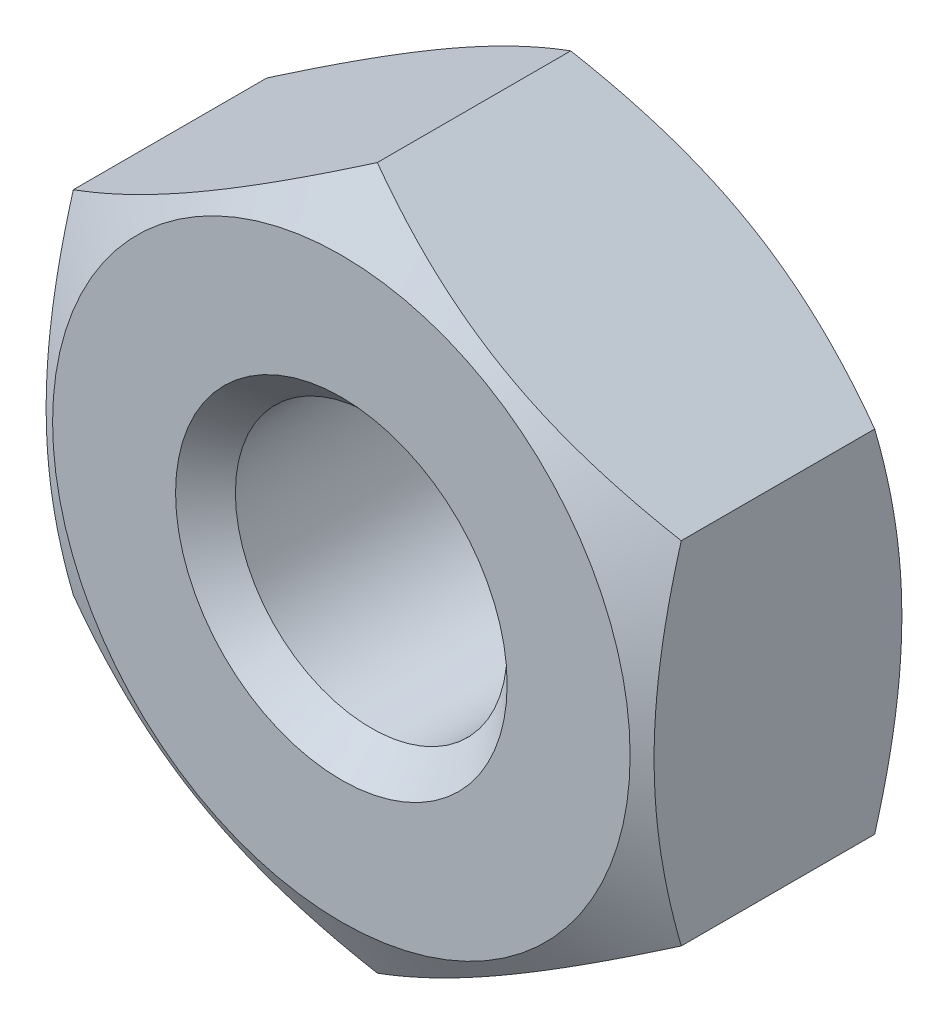
ISO-10303-21;
HEADER;
FILE_DESCRIPTION(('STEP AP214'),'2;1');
FILE_NAME('part.step','',(''),(''),'','','');
FILE_SCHEMA(('AUTOMOTIVE_DESIGN { 1 0 10303 214 1 1 1 1 }'));
ENDSEC;
DATA;
#1=APPLICATION_CONTEXT('core data for automotive mechanical design processes');
#2=APPLICATION_PROTOCOL_DEFINITION('international standard','automotive_design',2000,#1);
#3=PRODUCT_CONTEXT('',#1,'mechanical');
#4=PRODUCT('Part','Part','',(#3));
#5=PRODUCT_RELATED_PRODUCT_CATEGORY('part','',(#4));
#6=PRODUCT_DEFINITION_FORMATION('','',#4);
#7=PRODUCT_DEFINITION_CONTEXT('part definition',#1,'design');
#8=PRODUCT_DEFINITION('design','',#6,#7);
#9=PRODUCT_DEFINITION_SHAPE('','',#8);
#10=(LENGTH_UNIT() NAMED_UNIT(*) SI_UNIT(.MILLI.,.METRE.));
#11=(NAMED_UNIT(*) PLANE_ANGLE_UNIT() SI_UNIT($,.RADIAN.));
#12=(NAMED_UNIT(*) SI_UNIT($,.STERADIAN.) SOLID_ANGLE_UNIT());
#13=UNCERTAINTY_MEASURE_WITH_UNIT(LENGTH_MEASURE(1.E-05),#10,'distance_accuracy_value','');
#14=(GEOMETRIC_REPRESENTATION_CONTEXT(3) GLOBAL_UNCERTAINTY_ASSIGNED_CONTEXT((#13)) GLOBAL_UNIT_ASSIGNED_CONTEXT((#10,
#11,#12)) REPRESENTATION_CONTEXT('',''));
#15=CARTESIAN_POINT('',(0.,0.,0.));
#16=DIRECTION('',(0.,0.,1.));
#17=DIRECTION('',(1.,0.,0.));
#18=AXIS2_PLACEMENT_3D('',#15,#16,#17);
#19=CARTESIAN_POINT('',(0.,0.,2.4));
#20=DIRECTION('',(0.,0.,1.));
#21=DIRECTION('',(1.,0.,0.));
#22=AXIS2_PLACEMENT_3D('',#19,#20,#21);
#23=PLANE('',#22);
#24=CARTESIAN_POINT('',(-1.02977522342673E-12,1.27720916379669E-13,2.40000000002283));
#25=DIRECTION('',(0.,0.,1.));
#26=DIRECTION('',(1.,0.,0.));
#27=AXIS2_PLACEMENT_3D('',#24,#25,#26);
#28=CIRCLE('',#27,1.49999999996556);
#29=CARTESIAN_POINT('',(1.49999999996453,1.27720916379669E-13,2.40000000002283));
#30=VERTEX_POINT('',#29);
#31=EDGE_CURVE('E87',#30,#30,#28,.F.);
#32=ORIENTED_EDGE('',*,*,#31,.T.);
#33=EDGE_LOOP('',(#32));
#34=FACE_BOUND('',#33,.T.);
#35=CARTESIAN_POINT('',(0.,0.,2.39999999996598));
#36=DIRECTION('',(0.,0.,-1.));
#37=DIRECTION('',(-1.,0.,0.));
#38=AXIS2_PLACEMENT_3D('',#35,#36,#37);
#39=CIRCLE('',#38,2.61249999994106);
#40=CARTESIAN_POINT('',(-2.61249999994106,0.,2.39999999996598));
#41=VERTEX_POINT('',#40);
#42=EDGE_CURVE('E263',#41,#41,#39,.T.);
#43=ORIENTED_EDGE('',*,*,#42,.F.);
#44=EDGE_LOOP('',(#43));
#45=FACE_BOUND('',#44,.T.);
#46=ADVANCED_FACE('F17',(#34,#45),#23,.T.);
#47=CARTESIAN_POINT('',(0.,0.,2.0730442103627));
#48=DIRECTION('',(0.,0.,-1.));
#49=DIRECTION('',(-1.,0.,0.));
#50=AXIS2_PLACEMENT_3D('',#47,#48,#49);
#51=CONICAL_SURFACE('',#50,3.17880403940762,1.0471975512309);
#52=ORIENTED_EDGE('',*,*,#42,.T.);
#53=EDGE_LOOP('',(#52));
#54=FACE_BOUND('',#53,.T.);
#55=CARTESIAN_POINT('',(2.74999999999437,-1.5877132402829,2.07499424489068));
#56=CARTESIAN_POINT('',(2.62915415459346,-1.65748362164986,2.11528787033465));
#57=CARTESIAN_POINT('',(2.50726516957628,-1.72785625995844,2.15193281386618));
#58=CARTESIAN_POINT('',(2.26137677330216,-1.8698199917362,2.21589546219644));
#59=CARTESIAN_POINT('',(2.13737299450647,-1.94141360680505,2.24319054190458));
#60=CARTESIAN_POINT('',(1.89090215358318,-2.08371361315996,2.28567730131488));
#61=CARTESIAN_POINT('',(1.76847300353056,-2.15439811589933,2.30115178691857));
#62=CARTESIAN_POINT('',(1.52303893437114,-2.29609954179671,2.31962163868353));
#63=CARTESIAN_POINT('',(1.40003490673834,-2.36711595026196,2.32263230314838));
#64=CARTESIAN_POINT('',(1.17021507665882,-2.49980249102352,2.31635309590127));
#65=CARTESIAN_POINT('',(1.06336478787431,-2.56149253401623,2.30860497769265));
#66=CARTESIAN_POINT('',(0.850360305082701,-2.68447072949456,2.28405295637997));
#67=CARTESIAN_POINT('',(0.744206847251347,-2.7457584569489,2.26724067456207));
#68=CARTESIAN_POINT('',(0.530763555137408,-2.86898999910761,2.2252132240325));
#69=CARTESIAN_POINT('',(0.423500721356225,-2.93091822506522,2.19981998682475));
#70=CARTESIAN_POINT('',(0.210574416251554,-3.05385128463495,2.14218807372568));
#71=CARTESIAN_POINT('',(0.104908219200253,-3.11485769194676,2.10996293034815));
#72=CARTESIAN_POINT('',(7.62348261149699E-12,-3.17542648053783,2.07499424488522));
#73=B_SPLINE_CURVE_WITH_KNOTS('',3,(#55,#56,#57,#58,#59,#60,#61,#62,#63,#64,#65,#66,#67,#68,#69,
#70,#71,#72),.UNSPECIFIED.,.F.,.F.,(4,2,2,2,2,2,2,2,4),(0.,0.435897015882699,0.872841498396235,
1.29897295843839,1.72458122220686,2.09509820109152,2.46595826644026,2.8450422308937,
3.22338221355378),.UNSPECIFIED.);
#74=CARTESIAN_POINT('',(2.74999999999897,-1.5877132402658,2.07499424488442));
#75=VERTEX_POINT('',#74);
#76=CARTESIAN_POINT('',(3.83159163526158E-12,-3.17542648054002,2.07499424488396));
#77=VERTEX_POINT('',#76);
#78=EDGE_CURVE('E82',#75,#77,#73,.T.);
#79=ORIENTED_EDGE('',*,*,#78,.F.);
#80=CARTESIAN_POINT('',(2.75000000000668,1.58771324026181,2.07499424489062));
#81=CARTESIAN_POINT('',(2.75000000000174,1.44817247751933,2.11528787033461));
#82=CARTESIAN_POINT('',(2.74999999999971,1.30742720089867,2.15193281386616));
#83=CARTESIAN_POINT('',(2.74999999999822,1.02349973734059,2.21589546219647));
#84=CARTESIAN_POINT('',(2.74999999999877,0.880312507203831,2.24319054190464));
#85=CARTESIAN_POINT('',(2.74999999999916,0.595712494494699,2.285677301315));
#86=CARTESIAN_POINT('',(2.74999999999902,0.454343489015704,2.30115178691872));
#87=CARTESIAN_POINT('',(2.74999999999892,0.170940637220772,2.31962163868374));
#88=CARTESIAN_POINT('',(2.74999999999896,0.0289078202903395,2.32263230314861));
#89=CARTESIAN_POINT('',(2.74999999999898,-0.236465261232741,2.31635309590155));
#90=CARTESIAN_POINT('',(2.74999999999897,-0.359845347218192,2.30860497769295));
#91=CARTESIAN_POINT('',(2.74999999999897,-0.605801738174864,2.28405295638032));
#92=CARTESIAN_POINT('',(2.74999999999897,-0.728377193083556,2.26724067456244));
#93=CARTESIAN_POINT('',(2.74999999999897,-0.974840277400978,2.22521322403289));
#94=CARTESIAN_POINT('',(2.74999999999897,-1.0986967293162,2.19981998682516));
#95=CARTESIAN_POINT('',(2.74999999999897,-1.34456284845569,2.14218807372611));
#96=CARTESIAN_POINT('',(2.74999999999897,-1.46657566307932,2.10996293034859));
#97=CARTESIAN_POINT('',(2.74999999999897,-1.58771324026147,2.07499424488567));
#98=B_SPLINE_CURVE_WITH_KNOTS('',3,(#80,#81,#82,#83,#84,#85,#86,#87,#88,#89,#90,#91,#92,#93,#94,
#95,#96,#97),.UNSPECIFIED.,.F.,.F.,(4,2,2,2,2,2,2,2,4),(0.,0.435897015882711,0.872841498396259,
1.29897295843843,1.7245812222069,2.09509820109157,2.46595826644033,2.84504223089378,
3.22338221355388),.UNSPECIFIED.);
#99=CARTESIAN_POINT('',(2.74999999999415,1.58771324026881,2.07499424488596));
#100=VERTEX_POINT('',#99);
#101=EDGE_CURVE('E79',#100,#75,#98,.T.);
#102=ORIENTED_EDGE('',*,*,#101,.F.);
#103=CARTESIAN_POINT('',(1.17683513861142E-11,3.17542648054477,2.07499424489032));
#104=CARTESIAN_POINT('',(0.120845845407717,3.10565609916914,2.11528787033424));
#105=CARTESIAN_POINT('',(0.242734830422868,3.035283460857,2.15193281386577));
#106=CARTESIAN_POINT('',(0.488623226695529,2.89331972907662,2.21589546219607));
#107=CARTESIAN_POINT('',(0.612627005491789,2.82172611400871,2.24319054190426));
#108=CARTESIAN_POINT('',(0.85909784641551,2.67942610765447,2.28567730131463));
#109=CARTESIAN_POINT('',(0.981526996468012,2.60874160491483,2.30115178691835));
#110=CARTESIAN_POINT('',(1.22696106562737,2.46704017901725,2.31962163868338));
#111=CARTESIAN_POINT('',(1.34996509326023,2.39602377055205,2.32263230314826));
#112=CARTESIAN_POINT('',(1.57978492333975,2.26333722979056,2.31635309590121));
#113=CARTESIAN_POINT('',(1.6866352121242,2.20164718679786,2.30860497769262));
#114=CARTESIAN_POINT('',(1.8996396949157,2.07866899131958,2.28405295638002));
#115=CARTESIAN_POINT('',(2.00579315274701,2.01738126386527,2.26724067456215));
#116=CARTESIAN_POINT('',(2.21923644486085,1.89414972170662,2.22521322403266));
#117=CARTESIAN_POINT('',(2.32649927864198,1.83222149574904,2.19981998682496));
#118=CARTESIAN_POINT('',(2.53942558374655,1.70928843617936,2.14218807372598));
#119=CARTESIAN_POINT('',(2.64509178079781,1.64828202886758,2.10996293034849));
#120=CARTESIAN_POINT('',(2.74999999999039,1.58771324027654,2.07499424488561));
#121=B_SPLINE_CURVE_WITH_KNOTS('',3,(#103,#104,#105,#106,#107,#108,#109,#110,#111,#112,#113,
#114,#115,#116,#117,#118,#119,#120),.UNSPECIFIED.,.F.,.F.,(4,2,2,2,2,2,2,2,4),(0.,
0.435897015882777,0.872841498396396,1.29897295843864,1.72458122220718,2.09509820109166,
2.46595826644022,2.84504223089346,3.22338221355334),.UNSPECIFIED.);
#122=CARTESIAN_POINT('',(-5.59092861276659E-12,3.1754264805402,2.07499424488385));
#123=VERTEX_POINT('',#122);
#124=EDGE_CURVE('E67',#123,#100,#121,.T.);
#125=ORIENTED_EDGE('',*,*,#124,.F.);
#126=CARTESIAN_POINT('',(-2.7499999999963,1.58771324028345,2.07499424488979));
#127=CARTESIAN_POINT('',(-2.62915415459525,1.65748362165034,2.11528787033371));
#128=CARTESIAN_POINT('',(-2.50726516957799,1.72785625995891,2.15193281386524));
#129=CARTESIAN_POINT('',(-2.26137677330373,1.8698199917367,2.21589546219553));
#130=CARTESIAN_POINT('',(-2.13737299450799,1.94141360680559,2.24319054190371));
#131=CARTESIAN_POINT('',(-1.89090215358459,2.08371361316057,2.28567730131408));
#132=CARTESIAN_POINT('',(-1.76847300353191,2.15439811589998,2.30115178691779));
#133=CARTESIAN_POINT('',(-1.52303893437238,2.29609954179742,2.3196216386828));
#134=CARTESIAN_POINT('',(-1.40003490673952,2.3671159502627,2.32263230314766));
#135=CARTESIAN_POINT('',(-1.17021507665999,2.49980249102426,2.31635309590059));
#136=CARTESIAN_POINT('',(-1.06336478787555,2.56149253401694,2.30860497769199));
#137=CARTESIAN_POINT('',(-0.850360305084067,2.68447072949519,2.28405295637939));
#138=CARTESIAN_POINT('',(-0.744206847252775,2.7457584569495,2.26724067456152));
#139=CARTESIAN_POINT('',(-0.530763555138959,2.86898999910813,2.22521322403203));
#140=CARTESIAN_POINT('',(-0.423500721357839,2.9309182250657,2.19981998682434));
#141=CARTESIAN_POINT('',(-0.210574416253292,3.05385128463536,2.14218807372537));
#142=CARTESIAN_POINT('',(-0.104908219202051,3.11485769194714,2.10996293034789));
#143=CARTESIAN_POINT('',(-9.4799090285621E-12,3.17542648053818,2.07499424488502));
#144=B_SPLINE_CURVE_WITH_KNOTS('',3,(#126,#127,#128,#129,#130,#131,#132,#133,#134,#135,#136,
#137,#138,#139,#140,#141,#142,#143),.UNSPECIFIED.,.F.,.F.,(4,2,2,2,2,2,2,2,4),(0.,
0.435897015882901,0.872841498396644,1.29897295843902,1.72458122220768,2.09509820109212,
2.46595826644064,2.84504223089383,3.22338221355367),.UNSPECIFIED.);
#145=CARTESIAN_POINT('',(-2.75000000000102,1.58771324026589,2.07499424488337));
#146=VERTEX_POINT('',#145);
#147=EDGE_CURVE('E100',#146,#123,#144,.T.);
#148=ORIENTED_EDGE('',*,*,#147,.F.);
#149=CARTESIAN_POINT('',(-2.75000000000893,-1.58771324026134,2.07499424488984));
#150=CARTESIAN_POINT('',(-2.75000000000387,-1.44817247751878,2.11528787033374));
#151=CARTESIAN_POINT('',(-2.7500000000018,-1.30742720089805,2.15193281386525));
#152=CARTESIAN_POINT('',(-2.75000000000027,-1.02349973733983,2.2158954621955));
#153=CARTESIAN_POINT('',(-2.75000000000083,-0.880312507203001,2.24319054190365));
#154=CARTESIAN_POINT('',(-2.75000000000123,-0.595712494493736,2.28567730131396));
#155=CARTESIAN_POINT('',(-2.75000000000109,-0.454343489014672,2.30115178691764));
#156=CARTESIAN_POINT('',(-2.75000000000098,-0.170940637219606,2.31962163868259));
#157=CARTESIAN_POINT('',(-2.75000000000102,-0.0289078202891083,2.32263230314743));
#158=CARTESIAN_POINT('',(-2.75000000000104,0.236465261233928,2.31635309590031));
#159=CARTESIAN_POINT('',(-2.75000000000103,0.359845347219271,2.30860497769169));
#160=CARTESIAN_POINT('',(-2.75000000000102,0.605801738175726,2.28405295637905));
#161=CARTESIAN_POINT('',(-2.75000000000102,0.72837719308431,2.26724067456117));
#162=CARTESIAN_POINT('',(-2.75000000000102,0.974840277401511,2.22521322403167));
#163=CARTESIAN_POINT('',(-2.75000000000102,1.09869672931662,2.19981998682397));
#164=CARTESIAN_POINT('',(-2.75000000000102,1.34456284845589,2.142188073725));
#165=CARTESIAN_POINT('',(-2.75000000000102,1.46657566307941,2.10996293034752));
#166=CARTESIAN_POINT('',(-2.75000000000102,1.58771324026145,2.07499424488465));
#167=B_SPLINE_CURVE_WITH_KNOTS('',3,(#149,#150,#151,#152,#153,#154,#155,#156,#157,#158,#159,
#160,#161,#162,#163,#164,#165,#166),.UNSPECIFIED.,.F.,.F.,(4,2,2,2,2,2,2,2,4),(0.,
0.435897015882891,0.872841498396622,1.29897295843899,1.72458122220765,2.095098201092,
2.46595826644043,2.84504223089354,3.22338221355329),.UNSPECIFIED.);
#168=CARTESIAN_POINT('',(-2.74999999999611,-1.5877132402742,2.07499424488343));
#169=VERTEX_POINT('',#168);
#170=EDGE_CURVE('E104',#169,#146,#167,.T.);
#171=ORIENTED_EDGE('',*,*,#170,.F.);
#172=CARTESIAN_POINT('',(-1.34834004301414E-11,-3.17542648054464,2.07499424489029));
#173=CARTESIAN_POINT('',(-0.120845845409466,-3.10565609916905,2.11528787033421));
#174=CARTESIAN_POINT('',(-0.242734830424639,-3.03528346085693,2.15193281386572));
#175=CARTESIAN_POINT('',(-0.488623226697329,-2.89331972907655,2.21589546219595));
#176=CARTESIAN_POINT('',(-0.612627005493596,-2.82172611400863,2.24319054190408));
#177=CARTESIAN_POINT('',(-0.859097846417334,-2.67942610765437,2.28567730131436));
#178=CARTESIAN_POINT('',(-0.981526996469844,-2.60874160491473,2.30115178691803));
#179=CARTESIAN_POINT('',(-1.22696106562922,-2.46704017901715,2.31962163868296));
#180=CARTESIAN_POINT('',(-1.34996509326208,-2.39602377055195,2.32263230314778));
#181=CARTESIAN_POINT('',(-1.57978492334161,-2.26333722979044,2.31635309590064));
#182=CARTESIAN_POINT('',(-1.68663521212607,-2.20164718679774,2.30860497769201));
#183=CARTESIAN_POINT('',(-1.89963969491757,-2.07866899131946,2.28405295637934));
#184=CARTESIAN_POINT('',(-2.00579315274888,-2.01738126386515,2.26724067456144));
#185=CARTESIAN_POINT('',(-2.21923644486273,-1.8941497217065,2.22521322403188));
#186=CARTESIAN_POINT('',(-2.32649927864386,-1.83222149574892,2.19981998682415));
#187=CARTESIAN_POINT('',(-2.53942558374843,-1.70928843617924,2.14218807372512));
#188=CARTESIAN_POINT('',(-2.64509178079969,-1.64828202886746,2.10996293034761));
#189=CARTESIAN_POINT('',(-2.74999999999227,-1.58771324027641,2.07499424488471));
#190=B_SPLINE_CURVE_WITH_KNOTS('',3,(#172,#173,#174,#175,#176,#177,#178,#179,#180,#181,#182,
#183,#184,#185,#186,#187,#188,#189),.UNSPECIFIED.,.F.,.F.,(4,2,2,2,2,2,2,2,4),(0.,
0.435897015882791,0.872841498396417,1.29897295843868,1.72458122220723,2.09509820109174,
2.46595826644031,2.84504223089357,3.22338221355348),.UNSPECIFIED.);
#191=EDGE_CURVE('E108',#77,#169,#190,.T.);
#192=ORIENTED_EDGE('',*,*,#191,.F.);
#193=EDGE_LOOP('',(#79,#102,#125,#148,#171,#192));
#194=FACE_BOUND('',#193,.T.);
#195=ADVANCED_FACE('F80',(#54,#194),#51,.T.);
#196=CARTESIAN_POINT('',(-1.02977522342673E-12,1.27720916379669E-13,2.40000000002283));
#197=DIRECTION('',(0.,0.,1.));
#198=DIRECTION('',(1.,0.,0.));
#199=AXIS2_PLACEMENT_3D('',#196,#197,#198);
#200=CONICAL_SURFACE('',#199,1.49999999996556,0.785398163397448);
#201=CARTESIAN_POINT('',(-1.02974987642989E-12,1.27720916379669E-13,2.129367061317));
#202=DIRECTION('',(0.,0.,1.));
#203=DIRECTION('',(1.,0.,0.));
#204=AXIS2_PLACEMENT_3D('',#201,#202,#203);
#205=CIRCLE('',#204,1.22936706125);
#206=CARTESIAN_POINT('',(1.22936706124897,1.27720916379669E-13,2.129367061317));
#207=VERTEX_POINT('',#206);
#208=EDGE_CURVE('E92',#207,#207,#205,.F.);
#209=ORIENTED_EDGE('',*,*,#208,.T.);
#210=EDGE_LOOP('',(#209));
#211=FACE_BOUND('',#210,.T.);
#212=ORIENTED_EDGE('',*,*,#31,.F.);
#213=EDGE_LOOP('',(#212));
#214=FACE_BOUND('',#213,.T.);
#215=ADVANCED_FACE('F165',(#211,#214),#200,.F.);
#216=CARTESIAN_POINT('',(2.74999999999897,-1.58771324027135,0.));
#217=DIRECTION('',(1.,0.,0.));
#218=DIRECTION('',(0.,1.,0.));
#219=AXIS2_PLACEMENT_3D('',#216,#217,#218);
#220=PLANE('',#219);
#221=ORIENTED_EDGE('',*,*,#101,.T.);
#222=DIRECTION('',(0.,0.,1.));
#223=VECTOR('',#222,1.);
#224=CARTESIAN_POINT('',(2.74999999999897,-1.58771324027135,0.));
#225=LINE('',#224,#223);
#226=CARTESIAN_POINT('',(2.74999999999897,-1.58771319055351,0.325005740673968));
#227=VERTEX_POINT('',#226);
#228=EDGE_CURVE('E86',#227,#75,#225,.T.);
#229=ORIENTED_EDGE('',*,*,#228,.F.);
#230=CARTESIAN_POINT('',(2.75000001439945,1.5877131433654,0.325005717623926));
#231=CARTESIAN_POINT('',(2.75000000517098,1.44817238165556,0.284712100384513));
#232=CARTESIAN_POINT('',(2.75000000138515,1.30742710694928,0.248067161846317));
#233=CARTESIAN_POINT('',(2.74999999860945,1.02349964807074,0.184104520628629));
#234=CARTESIAN_POINT('',(2.74999999963112,0.880312420700691,0.15680944303534));
#235=CARTESIAN_POINT('',(2.75000000035771,0.595712413097851,0.11432268843318));
#236=CARTESIAN_POINT('',(2.7500000000946,0.4543434099541,0.0988482055339121));
#237=CARTESIAN_POINT('',(2.74999999990346,0.170940563117122,0.0803783586799936));
#238=CARTESIAN_POINT('',(2.74999999997502,0.0289077488091648,0.0773676964208761));
#239=CARTESIAN_POINT('',(2.75000000001982,-0.23646531622332,0.0836469070688498));
#240=CARTESIAN_POINT('',(2.75000000000459,-0.359845388384313,0.0913950256385638));
#241=CARTESIAN_POINT('',(2.74999999999334,-0.605801751828249,0.115947045567591));
#242=CARTESIAN_POINT('',(2.74999999999735,-0.72837719304894,0.132759325637604));
#243=CARTESIAN_POINT('',(2.75000000000063,-0.974840249506599,0.174786770806271));
#244=CARTESIAN_POINT('',(2.7499999999998,-1.09869668726343,0.200180004328257));
#245=CARTESIAN_POINT('',(2.74999999999814,-1.34456277853625,0.257811908688404));
#246=CARTESIAN_POINT('',(2.74999999999732,-1.46657557945033,0.290037047017807));
#247=CARTESIAN_POINT('',(2.74999999999897,-1.58771314312474,0.325005726982461));
#248=B_SPLINE_CURVE_WITH_KNOTS('',3,(#230,#231,#232,#233,#234,#235,#236,#237,#238,#239,#240,
#241,#242,#243,#244,#245,#246,#247),.UNSPECIFIED.,.F.,.F.,(4,2,2,2,2,2,2,2,4),(0.,
0.435897006562884,0.872841479850843,1.29897293198224,1.72458118779812,2.09509812548147,
2.46595814954132,2.84504207022854,3.22338200933583),.UNSPECIFIED.);
#249=CARTESIAN_POINT('',(2.75000002884228,1.58771322361889,0.325005764640775));
#250=VERTEX_POINT('',#249);
#251=EDGE_CURVE('E91',#250,#227,#248,.T.);
#252=ORIENTED_EDGE('',*,*,#251,.F.);
#253=DIRECTION('',(0.,0.,1.));
#254=VECTOR('',#253,1.);
#255=CARTESIAN_POINT('',(2.74999999999896,1.58771324027159,0.));
#256=LINE('',#255,#254);
#257=EDGE_CURVE('E72',#100,#250,#256,.F.);
#258=ORIENTED_EDGE('',*,*,#257,.F.);
#259=EDGE_LOOP('',(#221,#229,#252,#258));
#260=FACE_BOUND('',#259,.T.);
#261=ADVANCED_FACE('F90',(#260),#220,.T.);
#262=CARTESIAN_POINT('',(-1.03462333959023E-12,-3.17542648054283,0.));
#263=DIRECTION('',(0.500000000000002,-0.866025403784438,0.));
#264=DIRECTION('',(0.866025403784438,0.500000000000002,0.));
#265=AXIS2_PLACEMENT_3D('',#262,#263,#264);
#266=PLANE('',#265);
#267=ORIENTED_EDGE('',*,*,#78,.T.);
#268=DIRECTION('',(0.,0.,1.));
#269=VECTOR('',#268,1.);
#270=CARTESIAN_POINT('',(-1.03389519168218E-12,-3.17542648054283,0.));
#271=LINE('',#270,#269);
#272=CARTESIAN_POINT('',(4.30546693568705E-08,-3.17542645568461,0.325005740674854));
#273=VERTEX_POINT('',#272);
#274=EDGE_CURVE('E109',#273,#77,#271,.T.);
#275=ORIENTED_EDGE('',*,*,#274,.F.);
#276=CARTESIAN_POINT('',(2.75000005767715,-1.58771320697084,0.32500577425233));
#277=CARTESIAN_POINT('',(2.6291542113513,-1.65748358887751,0.284712147239813));
#278=CARTESIAN_POINT('',(2.50726522540158,-1.72785622772684,0.248067202040877));
#279=CARTESIAN_POINT('',(2.26137682717161,-1.86981996063551,0.184104550244697));
#280=CARTESIAN_POINT('',(2.13737304735209,-1.94141357629485,0.156809468739768));
#281=CARTESIAN_POINT('',(1.89090220432437,-2.0837135838643,0.114322705748284));
#282=CARTESIAN_POINT('',(1.76847305319417,-2.15439808722597,0.0988482183586672));
#283=CARTESIAN_POINT('',(1.52303898175165,-2.29609951444162,0.0803783631528396));
#284=CARTESIAN_POINT('',(1.40003495291353,-2.36711592360272,0.0773676970320543));
#285=CARTESIAN_POINT('',(1.17021512501017,-2.49980246310784,0.0836469013366563));
#286=CARTESIAN_POINT('',(1.06336483961152,-2.56149250414574,0.0913950178133597));
#287=CARTESIAN_POINT('',(0.850360363461781,-2.68447069578938,0.115947035225563));
#288=CARTESIAN_POINT('',(0.744206908886238,-2.74575842136398,0.132759314873753));
#289=CARTESIAN_POINT('',(0.530763623312978,-2.86898995974642,0.174786760740674));
#290=CARTESIAN_POINT('',(0.423500792812539,-2.93091818380989,0.200179995442589));
#291=CARTESIAN_POINT('',(0.21057449412858,-3.05385123967263,0.257811903403027));
#292=CARTESIAN_POINT('',(0.104908300217783,-3.11485764517127,0.290037044149624));
#293=CARTESIAN_POINT('',(8.41281215383024E-08,-3.17542643197084,0.325005726983704));
#294=B_SPLINE_CURVE_WITH_KNOTS('',3,(#276,#277,#278,#279,#280,#281,#282,#283,#284,#285,#286,
#287,#288,#289,#290,#291,#292,#293),.UNSPECIFIED.,.F.,.F.,(4,2,2,2,2,2,2,2,4),(0.,
0.435897020281128,0.872841507296636,1.29897297163466,1.72458123966468,2.09509820654854,
2.46595825985409,2.84504221166836,3.22338218180186),.UNSPECIFIED.);
#295=EDGE_CURVE('E209',#227,#273,#294,.T.);
#296=ORIENTED_EDGE('',*,*,#295,.F.);
#297=ORIENTED_EDGE('',*,*,#228,.T.);
#298=EDGE_LOOP('',(#267,#275,#296,#297));
#299=FACE_BOUND('',#298,.T.);
#300=ADVANCED_FACE('F197',(#299),#266,.T.);
#301=CARTESIAN_POINT('',(-2.75000000000104,-1.58771324027135,0.));
#302=DIRECTION('',(-0.500000000000001,-0.866025403784438,0.));
#303=DIRECTION('',(0.866025403784438,-0.500000000000001,0.));
#304=AXIS2_PLACEMENT_3D('',#301,#302,#303);
#305=PLANE('',#304);
#306=ORIENTED_EDGE('',*,*,#191,.T.);
#307=DIRECTION('',(0.,0.,1.));
#308=VECTOR('',#307,1.);
#309=CARTESIAN_POINT('',(-2.75000000000104,-1.58771324027135,0.));
#310=LINE('',#309,#308);
#311=CARTESIAN_POINT('',(-2.74999995694535,-1.58771326512957,0.325005740675408));
#312=VERTEX_POINT('',#311);
#313=EDGE_CURVE('E105',#312,#169,#310,.T.);
#314=ORIENTED_EDGE('',*,*,#313,.F.);
#315=CARTESIAN_POINT('',(5.7674242981158E-08,-3.17542651384167,0.325005774251848));
#316=CARTESIAN_POINT('',(-0.120845788651593,-3.105656131935,0.284712147239411));
#317=CARTESIAN_POINT('',(-0.242734774601302,-3.03528349308568,0.248067202040564));
#318=CARTESIAN_POINT('',(-0.488623172831235,-2.89331976017702,0.184104550244571));
#319=CARTESIAN_POINT('',(-0.612626952650741,-2.8217261445177,0.156809468739743));
#320=CARTESIAN_POINT('',(-0.859097795678428,-2.67942613694827,0.11432270574846));
#321=CARTESIAN_POINT('',(-0.981526946808605,-2.60874163358661,0.098848218358945));
#322=CARTESIAN_POINT('',(-1.22696101825109,-2.46704020637098,0.0803783631533195));
#323=CARTESIAN_POINT('',(-1.34996504708918,-2.3960237972099,0.0773676970326342));
#324=CARTESIAN_POINT('',(-1.5797848749923,-2.26333725770492,0.0836469013374049));
#325=CARTESIAN_POINT('',(-1.68663516039072,-2.20164721666715,0.0913950178141613));
#326=CARTESIAN_POINT('',(-1.89963963654002,-2.07866902502376,0.115947035226425));
#327=CARTESIAN_POINT('',(-2.00579309111534,-2.01738129944929,0.132759314874623));
#328=CARTESIAN_POINT('',(-2.21923637668815,-1.89414976106711,0.174786760741516));
#329=CARTESIAN_POINT('',(-2.32649920718836,-1.83222153700377,0.200179995443395));
#330=CARTESIAN_POINT('',(-2.53942550587187,-1.7092884811413,0.257811903403728));
#331=CARTESIAN_POINT('',(-2.64509169978245,-1.64828207564278,0.290037044150256));
#332=CARTESIAN_POINT('',(-2.74999991587189,-1.58771328884334,0.325005726984256));
#333=B_SPLINE_CURVE_WITH_KNOTS('',3,(#315,#316,#317,#318,#319,#320,#321,#322,#323,#324,#325,
#326,#327,#328,#329,#330,#331,#332),.UNSPECIFIED.,.F.,.F.,(4,2,2,2,2,2,2,2,4),(0.,
0.435897020281017,0.872841507296409,1.29897297163434,1.72458123966427,2.09509820654737,
2.46595825985217,2.84504221166564,3.22338218179835),.UNSPECIFIED.);
#334=EDGE_CURVE('E203',#273,#312,#333,.T.);
#335=ORIENTED_EDGE('',*,*,#334,.F.);
#336=ORIENTED_EDGE('',*,*,#274,.T.);
#337=EDGE_LOOP('',(#306,#314,#335,#336));
#338=FACE_BOUND('',#337,.T.);
#339=ADVANCED_FACE('F193',(#338),#305,.T.);
#340=CARTESIAN_POINT('',(-2.75000000000102,1.58771324027159,0.));
#341=DIRECTION('',(-1.,0.,0.));
#342=DIRECTION('',(0.,-1.,0.));
#343=AXIS2_PLACEMENT_3D('',#340,#341,#342);
#344=PLANE('',#343);
#345=ORIENTED_EDGE('',*,*,#170,.T.);
#346=DIRECTION('',(0.,0.,1.));
#347=VECTOR('',#346,1.);
#348=CARTESIAN_POINT('',(-2.75000000000102,1.58771324027159,0.));
#349=LINE('',#348,#347);
#350=CARTESIAN_POINT('',(-2.75000000000102,1.58771319057777,0.325005740681996));
#351=VERTEX_POINT('',#350);
#352=EDGE_CURVE('E101',#351,#146,#349,.T.);
#353=ORIENTED_EDGE('',*,*,#352,.F.);
#354=CARTESIAN_POINT('',(-2.75000000000104,-1.58771330686835,0.325005774252204));
#355=CARTESIAN_POINT('',(-2.75000000000104,-1.44817254305497,0.284712147239758));
#356=CARTESIAN_POINT('',(-2.75000000000104,-1.30742726535629,0.248067202040903));
#357=CARTESIAN_POINT('',(-2.75000000000104,-1.02349979953889,0.184104550244901));
#358=CARTESIAN_POINT('',(-2.75000000000104,-0.880312568220195,0.156809468740069));
#359=CARTESIAN_POINT('',(-2.75000000000103,-0.595712553081276,0.114322705748792));
#360=CARTESIAN_POINT('',(-2.75000000000103,-0.454343546357935,0.0988482183592826));
#361=CARTESIAN_POINT('',(-2.75000000000103,-0.170940691926663,0.0803783631536674));
#362=CARTESIAN_POINT('',(-2.75000000000103,-0.0289078736044892,0.0773676970329865));
#363=CARTESIAN_POINT('',(-2.75000000000103,0.236465205409569,0.0836469013378635));
#364=CARTESIAN_POINT('',(-2.75000000000103,0.3598452874892,0.0913950178150409));
#365=CARTESIAN_POINT('',(-2.75000000000103,0.605801670784095,0.11594703522872));
#366=CARTESIAN_POINT('',(-2.75000000000103,0.728377121937058,0.132759314877914));
#367=CARTESIAN_POINT('',(-2.75000000000102,0.974840198709554,0.174786760747288));
#368=CARTESIAN_POINT('',(-2.75000000000102,1.09869664684034,0.200179995450671));
#369=CARTESIAN_POINT('',(-2.75000000000102,1.34456275857336,0.257811903414336));
#370=CARTESIAN_POINT('',(-2.75000000000102,1.46657556957435,0.290037044162691));
#371=CARTESIAN_POINT('',(-2.75000000000102,1.58771314317714,0.325005726998613));
#372=B_SPLINE_CURVE_WITH_KNOTS('',3,(#354,#355,#356,#357,#358,#359,#360,#361,#362,#363,#364,
#365,#366,#367,#368,#369,#370,#371),.UNSPECIFIED.,.F.,.F.,(4,2,2,2,2,2,2,2,4),(0.,
0.435897020281151,0.872841507296683,1.29897297163465,1.7245812396646,2.09509820656,
2.46595825987713,2.84504221170357,3.22338218184915),.UNSPECIFIED.);
#373=EDGE_CURVE('E208',#312,#351,#372,.T.);
#374=ORIENTED_EDGE('',*,*,#373,.F.);
#375=ORIENTED_EDGE('',*,*,#313,.T.);
#376=EDGE_LOOP('',(#345,#353,#374,#375));
#377=FACE_BOUND('',#376,.T.);
#378=ADVANCED_FACE('F196',(#377),#344,.T.);
#379=CARTESIAN_POINT('',(-1.02202820453509E-12,3.17542648054306,0.));
#380=DIRECTION('',(-0.499999999999999,0.866025403784439,0.));
#381=DIRECTION('',(-0.866025403784439,-0.499999999999999,0.));
#382=AXIS2_PLACEMENT_3D('',#379,#380,#381);
#383=PLANE('',#382);
#384=ORIENTED_EDGE('',*,*,#147,.T.);
#385=DIRECTION('',(0.,0.,1.));
#386=VECTOR('',#385,1.);
#387=CARTESIAN_POINT('',(-6.42715047849407E-13,3.17542648054283,0.));
#388=LINE('',#387,#386);
#389=CARTESIAN_POINT('',(-4.3039118986248E-08,3.17542645569478,0.325005740680728));
#390=VERTEX_POINT('',#389);
#391=EDGE_CURVE('E73',#390,#123,#388,.T.);
#392=ORIENTED_EDGE('',*,*,#391,.F.);
#393=CARTESIAN_POINT('',(-2.75000005770676,1.58771320695517,0.325005774262614));
#394=CARTESIAN_POINT('',(-2.62915421138038,1.65748358886215,0.284712147249301));
#395=CARTESIAN_POINT('',(-2.50726522543012,1.72785622771179,0.248067202049523));
#396=CARTESIAN_POINT('',(-2.26137682719903,1.86981996062111,0.184104550251599));
#397=CARTESIAN_POINT('',(-2.13737304737891,1.94141357628079,0.156809468745772));
#398=CARTESIAN_POINT('',(-1.89090220435004,2.0837135838509,0.114322705752516));
#399=CARTESIAN_POINT('',(-1.76847305321929,2.1543980872129,0.0988482183620212));
#400=CARTESIAN_POINT('',(-1.52303898177558,2.29609951442923,0.0803783631545016));
#401=CARTESIAN_POINT('',(-1.40003495293685,2.36711592359068,0.0773676970329014));
#402=CARTESIAN_POINT('',(-1.17021512502789,2.49980246309903,0.0836469013362396));
#403=CARTESIAN_POINT('',(-1.06336483962427,2.5614925041398,0.0913950178128719));
#404=CARTESIAN_POINT('',(-0.850360363464643,2.68447069578915,0.115947035225793));
#405=CARTESIAN_POINT('',(-0.744206908884179,2.74575842136659,0.132759314874773));
#406=CARTESIAN_POINT('',(-0.530763623300941,2.86898995975479,0.174786760744032));
#407=CARTESIAN_POINT('',(-0.423500792795449,2.93091818382118,0.200179995447523));
#408=CARTESIAN_POINT('',(-0.210574494101556,3.05385123968965,0.257811903411661));
#409=CARTESIAN_POINT('',(-0.104908300185878,3.11485764519111,0.29003704416038));
#410=CARTESIAN_POINT('',(-8.40914064567103E-08,3.17542643199345,0.325005726996761));
#411=B_SPLINE_CURVE_WITH_KNOTS('',3,(#393,#394,#395,#396,#397,#398,#399,#400,#401,#402,#403,
#404,#405,#406,#407,#408,#409,#410),.UNSPECIFIED.,.F.,.F.,(4,2,2,2,2,2,2,2,4),(0.,
0.435897020283577,0.872841507301598,1.29897297164183,1.72458123967404,2.095098206575,
2.46595825989772,2.84504221173006,3.2233821818815),.UNSPECIFIED.);
#412=EDGE_CURVE('E35',#351,#390,#411,.T.);
#413=ORIENTED_EDGE('',*,*,#412,.F.);
#414=ORIENTED_EDGE('',*,*,#352,.T.);
#415=EDGE_LOOP('',(#384,#392,#413,#414));
#416=FACE_BOUND('',#415,.T.);
#417=ADVANCED_FACE('F141',(#416),#383,.T.);
#418=CARTESIAN_POINT('',(2.74999999999896,1.58771324027159,0.));
#419=DIRECTION('',(0.5,0.866025403784438,0.));
#420=DIRECTION('',(-0.866025403784438,0.5,0.));
#421=AXIS2_PLACEMENT_3D('',#418,#419,#420);
#422=PLANE('',#421);
#423=ORIENTED_EDGE('',*,*,#124,.T.);
#424=ORIENTED_EDGE('',*,*,#257,.T.);
#425=CARTESIAN_POINT('',(-5.7711567866455E-08,3.17542651386225,0.325005774263733));
#426=CARTESIAN_POINT('',(0.120845788660931,3.10565613192864,0.28471214723512));
#427=CARTESIAN_POINT('',(0.242734774657878,3.03528349305205,0.248067202022583));
#428=CARTESIAN_POINT('',(0.488623172989648,2.8933197600846,0.184104550205521));
#429=CARTESIAN_POINT('',(0.612626952863843,2.8217261443937,0.156809468693783));
#430=CARTESIAN_POINT('',(0.859097795900961,2.67942613681883,0.11432270571802));
#431=CARTESIAN_POINT('',(0.981526946984622,2.60874163348402,0.0988482183415729));
#432=CARTESIAN_POINT('',(1.22696101832561,2.46704020632699,0.0803783631508054));
#433=CARTESIAN_POINT('',(1.3499650471087,2.39602379719767,0.077367697031467));
#434=CARTESIAN_POINT('',(1.57978488694182,2.2633372508049,0.0836469016644935));
#435=CARTESIAN_POINT('',(1.68663518429955,2.20164720286242,0.0913950195533105));
#436=CARTESIAN_POINT('',(1.89963968416877,2.07866899752432,0.115947041733614));
#437=CARTESIAN_POINT('',(2.00579315050425,2.01738126516012,0.132759324742398));
#438=CARTESIAN_POINT('',(2.21923645986961,1.89414971304131,0.174786778989199));
#439=CARTESIAN_POINT('',(2.32649930239054,1.8322214820378,0.200180018771111));
#440=CARTESIAN_POINT('',(2.53942562467814,1.7092884125475,0.257811937996603));
#441=CARTESIAN_POINT('',(2.64509183017366,1.64828200036042,0.290037084921534));
#442=CARTESIAN_POINT('',(2.7500000576856,1.58771320696619,0.325005774255214));
#443=B_SPLINE_CURVE_WITH_KNOTS('',3,(#425,#426,#427,#428,#429,#430,#431,#432,#433,#434,#435,
#436,#437,#438,#439,#440,#441,#442),.UNSPECIFIED.,.F.,.F.,(4,2,2,2,2,2,2,2,4),(0.,
0.435897020449472,0.872841507654671,1.29897297182663,1.72458123967511,2.09509824804504,
2.46595834299015,2.84504233860631,3.2233823522082),.UNSPECIFIED.);
#444=EDGE_CURVE('E120',#390,#250,#443,.T.);
#445=ORIENTED_EDGE('',*,*,#444,.F.);
#446=ORIENTED_EDGE('',*,*,#391,.T.);
#447=EDGE_LOOP('',(#423,#424,#445,#446));
#448=FACE_BOUND('',#447,.T.);
#449=ADVANCED_FACE('F69',(#448),#422,.T.);
#450=CARTESIAN_POINT('',(-1.02974987642989E-12,1.27720916379669E-13,0.));
#451=DIRECTION('',(0.,0.,1.));
#452=DIRECTION('',(1.,0.,0.));
#453=AXIS2_PLACEMENT_3D('',#450,#451,#452);
#454=CYLINDRICAL_SURFACE('',#453,1.22936706125);
#455=CARTESIAN_POINT('',(-1.02974987642989E-12,1.27720916379669E-13,0.270632938679682));
#456=DIRECTION('',(0.,0.,-1.));
#457=DIRECTION('',(-1.,0.,0.));
#458=AXIS2_PLACEMENT_3D('',#455,#456,#457);
#459=CIRCLE('',#458,1.22936706128382);
#460=CARTESIAN_POINT('',(-1.22936706128485,1.27720916379669E-13,0.270632938679682));
#461=VERTEX_POINT('',#460);
#462=EDGE_CURVE('E117',#461,#461,#459,.T.);
#463=ORIENTED_EDGE('',*,*,#462,.T.);
#464=EDGE_LOOP('',(#463));
#465=FACE_BOUND('',#464,.T.);
#466=ORIENTED_EDGE('',*,*,#208,.F.);
#467=EDGE_LOOP('',(#466));
#468=FACE_BOUND('',#467,.T.);
#469=ADVANCED_FACE('F140',(#465,#468),#454,.F.);
#470=CARTESIAN_POINT('',(0.,0.,0.326955789546446));
#471=DIRECTION('',(0.,0.,1.));
#472=DIRECTION('',(1.,0.,0.));
#473=AXIS2_PLACEMENT_3D('',#470,#471,#472);
#474=CONICAL_SURFACE('',#473,3.17880403940762,1.04719755121925);
#475=CARTESIAN_POINT('',(0.,0.,0.));
#476=DIRECTION('',(0.,0.,1.));
#477=DIRECTION('',(1.,0.,0.));
#478=AXIS2_PLACEMENT_3D('',#475,#476,#477);
#479=CIRCLE('',#478,2.61250000005475);
#480=CARTESIAN_POINT('',(2.61250000005475,0.,0.));
#481=VERTEX_POINT('',#480);
#482=EDGE_CURVE('E26',#481,#481,#479,.T.);
#483=ORIENTED_EDGE('',*,*,#482,.T.);
#484=EDGE_LOOP('',(#483));
#485=FACE_BOUND('',#484,.T.);
#486=ORIENTED_EDGE('',*,*,#412,.T.);
#487=ORIENTED_EDGE('',*,*,#444,.T.);
#488=ORIENTED_EDGE('',*,*,#251,.T.);
#489=ORIENTED_EDGE('',*,*,#295,.T.);
#490=ORIENTED_EDGE('',*,*,#334,.T.);
#491=ORIENTED_EDGE('',*,*,#373,.T.);
#492=EDGE_LOOP('',(#486,#487,#488,#489,#490,#491));
#493=FACE_BOUND('',#492,.T.);
#494=ADVANCED_FACE('F134',(#485,#493),#474,.T.);
#495=CARTESIAN_POINT('',(-1.02977522342673E-12,1.27720916379669E-13,0.));
#496=DIRECTION('',(0.,0.,-1.));
#497=DIRECTION('',(-1.,0.,0.));
#498=AXIS2_PLACEMENT_3D('',#495,#496,#497);
#499=CONICAL_SURFACE('',#498,1.4999999999635,0.785398163397448);
#500=ORIENTED_EDGE('',*,*,#462,.F.);
#501=EDGE_LOOP('',(#500));
#502=FACE_BOUND('',#501,.T.);
#503=CARTESIAN_POINT('',(-1.02977522342673E-12,1.27720916379669E-13,0.));
#504=DIRECTION('',(0.,0.,-1.));
#505=DIRECTION('',(-1.,0.,0.));
#506=AXIS2_PLACEMENT_3D('',#503,#504,#505);
#507=CIRCLE('',#506,1.4999999999635);
#508=CARTESIAN_POINT('',(-1.49999999996453,1.27720916379669E-13,0.));
#509=VERTEX_POINT('',#508);
#510=EDGE_CURVE('E11',#509,#509,#507,.T.);
#511=ORIENTED_EDGE('',*,*,#510,.T.);
#512=EDGE_LOOP('',(#511));
#513=FACE_BOUND('',#512,.T.);
#514=ADVANCED_FACE('F235',(#502,#513),#499,.F.);
#515=CARTESIAN_POINT('',(0.,0.,0.));
#516=DIRECTION('',(0.,0.,1.));
#517=DIRECTION('',(1.,0.,0.));
#518=AXIS2_PLACEMENT_3D('',#515,#516,#517);
#519=PLANE('',#518);
#520=ORIENTED_EDGE('',*,*,#510,.F.);
#521=EDGE_LOOP('',(#520));
#522=FACE_BOUND('',#521,.T.);
#523=ORIENTED_EDGE('',*,*,#482,.F.);
#524=EDGE_LOOP('',(#523));
#525=FACE_BOUND('',#524,.T.);
#526=ADVANCED_FACE('F233',(#522,#525),#519,.F.);
#527=CLOSED_SHELL('',(#46,#195,#215,#261,#300,#339,#378,#417,#449,#469,#494,#514,#526));
#528=MANIFOLD_SOLID_BREP('B1',#527);
#529=ADVANCED_BREP_SHAPE_REPRESENTATION('',(#18,#528),#14);
#530=SHAPE_DEFINITION_REPRESENTATION(#9,#529);
ENDSEC;
END-ISO-10303-21;
